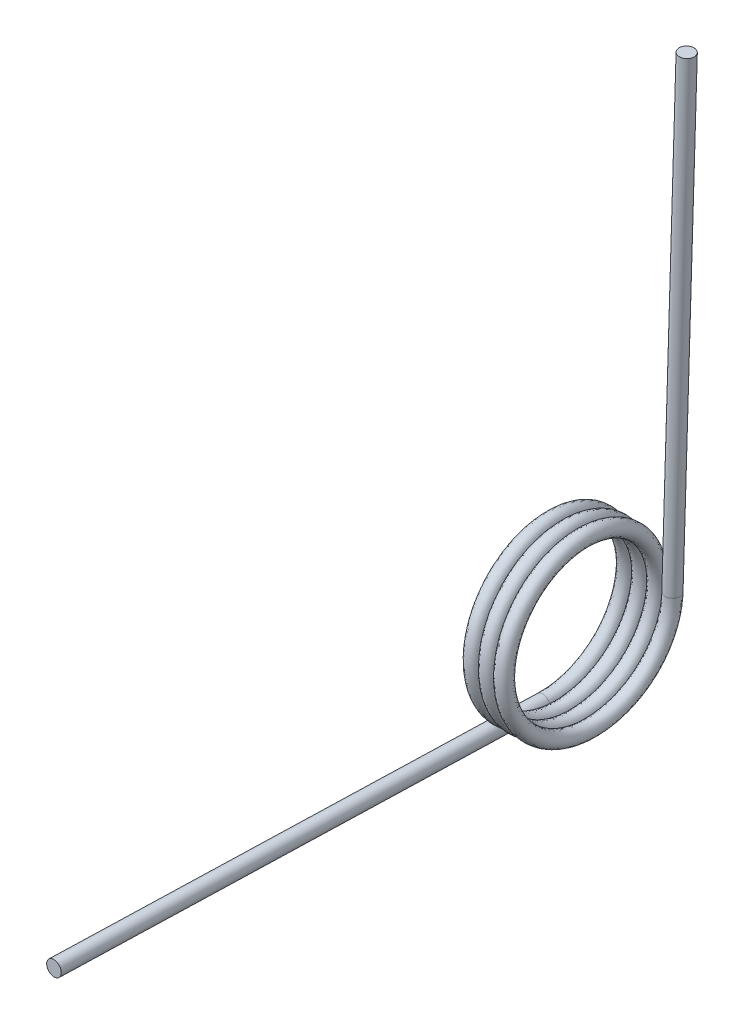
ISO-10303-21;
HEADER;
FILE_DESCRIPTION(('STEP AP214'),'2;1');
FILE_NAME('part.step','',(''),(''),'','','');
FILE_SCHEMA(('AUTOMOTIVE_DESIGN { 1 0 10303 214 1 1 1 1 }'));
ENDSEC;
DATA;
#1=APPLICATION_CONTEXT('core data for automotive mechanical design processes');
#2=APPLICATION_PROTOCOL_DEFINITION('international standard','automotive_design',2000,#1);
#3=PRODUCT_CONTEXT('',#1,'mechanical');
#4=PRODUCT('Part','Part','',(#3));
#5=PRODUCT_RELATED_PRODUCT_CATEGORY('part','',(#4));
#6=PRODUCT_DEFINITION_FORMATION('','',#4);
#7=PRODUCT_DEFINITION_CONTEXT('part definition',#1,'design');
#8=PRODUCT_DEFINITION('design','',#6,#7);
#9=PRODUCT_DEFINITION_SHAPE('','',#8);
#10=(LENGTH_UNIT() NAMED_UNIT(*) SI_UNIT(.MILLI.,.METRE.));
#11=(NAMED_UNIT(*) PLANE_ANGLE_UNIT() SI_UNIT($,.RADIAN.));
#12=(NAMED_UNIT(*) SI_UNIT($,.STERADIAN.) SOLID_ANGLE_UNIT());
#13=UNCERTAINTY_MEASURE_WITH_UNIT(LENGTH_MEASURE(1.E-05),#10,'distance_accuracy_value','');
#14=(GEOMETRIC_REPRESENTATION_CONTEXT(3) GLOBAL_UNCERTAINTY_ASSIGNED_CONTEXT((#13)) GLOBAL_UNIT_ASSIGNED_CONTEXT((#10,
#11,#12)) REPRESENTATION_CONTEXT('',''));
#15=CARTESIAN_POINT('',(0.,0.,0.));
#16=DIRECTION('',(0.,0.,1.));
#17=DIRECTION('',(1.,0.,0.));
#18=AXIS2_PLACEMENT_3D('',#15,#16,#17);
#19=CARTESIAN_POINT('',(-1.20595359726786,-12.8905,-0.0363066279999078));
#20=CARTESIAN_POINT('',(-1.00275359726786,-12.8695383585509,-7.47864027298878));
#21=CARTESIAN_POINT('',(-0.799553597267859,-6.41380753782633,-11.1816537814833));
#22=CARTESIAN_POINT('',(-0.59635359726786,0.0419232828982278,-14.8846672899777));
#23=CARTESIAN_POINT('',(-0.39315359726786,6.47669246217367,-11.1453471534834));
#24=CARTESIAN_POINT('',(-0.189953597267861,12.9114616414491,-7.40602701698897));
#25=CARTESIAN_POINT('',(0.0132464027321386,12.8905,0.0363066279999062));
#26=CARTESIAN_POINT('',(0.216446402732138,12.8695383585509,7.47864027298878));
#27=CARTESIAN_POINT('',(0.419646402732138,6.41380753782633,11.1816537814833));
#28=CARTESIAN_POINT('',(0.622846402732137,-0.041923282898226,14.8846672899777));
#29=CARTESIAN_POINT('',(0.826046402732136,-6.47669246217366,11.1453471534834));
#30=CARTESIAN_POINT('',(1.02924640273214,-12.9114616414491,7.40602701698897));
#31=CARTESIAN_POINT('',(1.23244640273214,-12.8905,-0.0363066279999078));
#32=CARTESIAN_POINT('',(1.43564640273214,-12.8695383585509,-7.47864027298878));
#33=CARTESIAN_POINT('',(1.63884640273213,-6.41380753782633,-11.1816537814833));
#34=CARTESIAN_POINT('',(1.84204640273213,0.0419232828982278,-14.8846672899777));
#35=CARTESIAN_POINT('',(2.04524640273213,6.47669246217367,-11.1453471534834));
#36=CARTESIAN_POINT('',(2.24844640273213,12.9114616414491,-7.40602701698897));
#37=CARTESIAN_POINT('',(2.45164640273213,12.8905,0.0363066279999062));
#38=CARTESIAN_POINT('',(2.65484640273213,12.8695383585509,7.47864027298878));
#39=CARTESIAN_POINT('',(2.85804640273213,6.41380753782633,11.1816537814833));
#40=CARTESIAN_POINT('',(3.06124640273213,-0.041923282898226,14.8846672899777));
#41=CARTESIAN_POINT('',(3.26444640273213,-6.47669246217366,11.1453471534834));
#42=CARTESIAN_POINT('',(3.46764640273213,-12.9114616414491,7.40602701698897));
#43=CARTESIAN_POINT('',(3.67084640273213,-12.8905,-0.0363066279999078));
#44=CARTESIAN_POINT('',(3.87404640273213,-12.8695383585509,-7.47864027298878));
#45=CARTESIAN_POINT('',(4.07724640273213,-6.41380753782633,-11.1816537814833));
#46=CARTESIAN_POINT('',(4.28044640273213,0.0419232828982278,-14.8846672899777));
#47=CARTESIAN_POINT('',(4.48364640273213,6.47669246217367,-11.1453471534834));
#48=CARTESIAN_POINT('',(4.68684640273213,12.9114616414491,-7.40602701698897));
#49=CARTESIAN_POINT('',(4.89004640273213,12.8905,0.0363066279999062));
#50=CARTESIAN_POINT('',(5.09324640273213,12.8695383585509,7.47864027298878));
#51=CARTESIAN_POINT('',(5.29644640273213,6.41380753782633,11.1816537814833));
#52=CARTESIAN_POINT('',(5.49964640273213,-0.041923282898226,14.8846672899777));
#53=CARTESIAN_POINT('',(5.70284640273212,-6.47669246217366,11.1453471534834));
#54=CARTESIAN_POINT('',(5.90604640273212,-12.9114616414491,7.40602701698897));
#55=CARTESIAN_POINT('',(6.10924640273212,-12.8905,-0.0363066279999078));
#56=CARTESIAN_POINT('',(6.31244640273212,-12.8695383585509,-7.47864027298878));
#57=CARTESIAN_POINT('',(6.51564640273212,-6.41380753782633,-11.1816537814833));
#58=CARTESIAN_POINT('',(6.71884640273212,0.0419232828982278,-14.8846672899777));
#59=CARTESIAN_POINT('',(6.92204640273212,6.47669246217367,-11.1453471534834));
#60=CARTESIAN_POINT('',(7.12524640273212,12.9114616414491,-7.40602701698897));
#61=CARTESIAN_POINT('',(7.32844640273212,12.8905,0.0363066279999062));
#62=CARTESIAN_POINT('',(7.53164640273212,12.8695383585509,7.47864027298878));
#63=CARTESIAN_POINT('',(7.73484640273212,6.41380753782633,11.1816537814833));
#64=CARTESIAN_POINT('',(7.93804640273212,-0.041923282898226,14.8846672899777));
#65=CARTESIAN_POINT('',(8.14124640273212,-6.47669246217366,11.1453471534834));
#66=CARTESIAN_POINT('',(8.34444640273212,-12.9114616414491,7.40602701698897));
#67=CARTESIAN_POINT('',(8.54764640273212,-12.8905,-0.0363066279999078));
#68=CARTESIAN_POINT('',(-1.20595359726786,-10.4775,-0.0363066279998857));
#69=CARTESIAN_POINT('',(-1.00275359726786,-10.4565383585509,-6.08549407343419));
#70=CARTESIAN_POINT('',(-0.79955359726786,-5.20730753782635,-9.0919344821514));
#71=CARTESIAN_POINT('',(-0.596353597267861,0.0419232828982025,-12.0983748908686));
#72=CARTESIAN_POINT('',(-0.393153597267861,5.27019246217365,-9.05562785415152));
#73=CARTESIAN_POINT('',(-0.189953597267862,10.4984616414491,-6.01288081743442));
#74=CARTESIAN_POINT('',(0.013246402732138,10.4775,0.0363066279998845));
#75=CARTESIAN_POINT('',(0.216446402732137,10.4565383585509,6.08549407343419));
#76=CARTESIAN_POINT('',(0.419646402732137,5.20730753782635,9.0919344821514));
#77=CARTESIAN_POINT('',(0.622846402732137,-0.0419232828982011,12.0983748908686));
#78=CARTESIAN_POINT('',(0.826046402732136,-5.27019246217364,9.05562785415152));
#79=CARTESIAN_POINT('',(1.02924640273214,-10.4984616414491,6.01288081743443));
#80=CARTESIAN_POINT('',(1.23244640273213,-10.4775,-0.0363066279998857));
#81=CARTESIAN_POINT('',(1.43564640273213,-10.4565383585509,-6.08549407343419));
#82=CARTESIAN_POINT('',(1.63884640273213,-5.20730753782635,-9.0919344821514));
#83=CARTESIAN_POINT('',(1.84204640273213,0.0419232828982025,-12.0983748908686));
#84=CARTESIAN_POINT('',(2.04524640273213,5.27019246217365,-9.05562785415152));
#85=CARTESIAN_POINT('',(2.24844640273213,10.4984616414491,-6.01288081743442));
#86=CARTESIAN_POINT('',(2.45164640273213,10.4775,0.0363066279998845));
#87=CARTESIAN_POINT('',(2.65484640273213,10.4565383585509,6.08549407343419));
#88=CARTESIAN_POINT('',(2.85804640273213,5.20730753782635,9.0919344821514));
#89=CARTESIAN_POINT('',(3.06124640273213,-0.0419232828982011,12.0983748908686));
#90=CARTESIAN_POINT('',(3.26444640273213,-5.27019246217364,9.05562785415152));
#91=CARTESIAN_POINT('',(3.46764640273213,-10.4984616414491,6.01288081743443));
#92=CARTESIAN_POINT('',(3.67084640273213,-10.4775,-0.0363066279998857));
#93=CARTESIAN_POINT('',(3.87404640273213,-10.4565383585509,-6.08549407343419));
#94=CARTESIAN_POINT('',(4.07724640273213,-5.20730753782635,-9.0919344821514));
#95=CARTESIAN_POINT('',(4.28044640273213,0.0419232828982025,-12.0983748908686));
#96=CARTESIAN_POINT('',(4.48364640273213,5.27019246217365,-9.05562785415152));
#97=CARTESIAN_POINT('',(4.68684640273213,10.4984616414491,-6.01288081743442));
#98=CARTESIAN_POINT('',(4.89004640273213,10.4775,0.0363066279998845));
#99=CARTESIAN_POINT('',(5.09324640273212,10.4565383585509,6.08549407343419));
#100=CARTESIAN_POINT('',(5.29644640273213,5.20730753782635,9.0919344821514));
#101=CARTESIAN_POINT('',(5.49964640273212,-0.0419232828982011,12.0983748908686));
#102=CARTESIAN_POINT('',(5.70284640273212,-5.27019246217364,9.05562785415152));
#103=CARTESIAN_POINT('',(5.90604640273212,-10.4984616414491,6.01288081743443));
#104=CARTESIAN_POINT('',(6.10924640273212,-10.4775,-0.0363066279998857));
#105=CARTESIAN_POINT('',(6.31244640273212,-10.4565383585509,-6.08549407343419));
#106=CARTESIAN_POINT('',(6.51564640273212,-5.20730753782635,-9.0919344821514));
#107=CARTESIAN_POINT('',(6.71884640273212,0.0419232828982025,-12.0983748908686));
#108=CARTESIAN_POINT('',(6.92204640273212,5.27019246217365,-9.05562785415152));
#109=CARTESIAN_POINT('',(7.12524640273212,10.4984616414491,-6.01288081743442));
#110=CARTESIAN_POINT('',(7.32844640273212,10.4775,0.0363066279998845));
#111=CARTESIAN_POINT('',(7.53164640273212,10.4565383585509,6.08549407343419));
#112=CARTESIAN_POINT('',(7.73484640273212,5.20730753782635,9.0919344821514));
#113=CARTESIAN_POINT('',(7.93804640273212,-0.0419232828982011,12.0983748908686));
#114=CARTESIAN_POINT('',(8.14124640273212,-5.27019246217364,9.05562785415152));
#115=CARTESIAN_POINT('',(8.34444640273212,-10.4984616414491,6.01288081743443));
#116=CARTESIAN_POINT('',(8.54764640273212,-10.4775,-0.0363066279998857));
#117=CARTESIAN_POINT('',(1.20595359726786,-10.4775,0.0363066279996597));
#118=CARTESIAN_POINT('',(1.40915359726786,-10.498461641449,-6.01288081743464));
#119=CARTESIAN_POINT('',(1.61235359726786,-5.27019246217346,-9.05562785415163));
#120=CARTESIAN_POINT('',(1.81555359726786,-0.041923282897943,-12.0983748908686));
#121=CARTESIAN_POINT('',(2.01875359726785,5.20730753782654,-9.09193448215129));
#122=CARTESIAN_POINT('',(2.22195359726785,10.456538358551,-6.08549407343397));
#123=CARTESIAN_POINT('',(2.42515359726785,10.4775,-0.036306627999661));
#124=CARTESIAN_POINT('',(2.62835359726785,10.498461641449,6.01288081743464));
#125=CARTESIAN_POINT('',(2.83155359726785,5.27019246217346,9.05562785415163));
#126=CARTESIAN_POINT('',(3.03475359726785,0.0419232828979445,12.0983748908686));
#127=CARTESIAN_POINT('',(3.23795359726785,-5.20730753782654,9.09193448215129));
#128=CARTESIAN_POINT('',(3.44115359726785,-10.456538358551,6.08549407343397));
#129=CARTESIAN_POINT('',(3.64435359726785,-10.4775,0.0363066279996597));
#130=CARTESIAN_POINT('',(3.84755359726785,-10.498461641449,-6.01288081743464));
#131=CARTESIAN_POINT('',(4.05075359726785,-5.27019246217346,-9.05562785415163));
#132=CARTESIAN_POINT('',(4.25395359726785,-0.041923282897943,-12.0983748908686));
#133=CARTESIAN_POINT('',(4.45715359726785,5.20730753782654,-9.09193448215129));
#134=CARTESIAN_POINT('',(4.66035359726785,10.456538358551,-6.08549407343397));
#135=CARTESIAN_POINT('',(4.86355359726785,10.4775,-0.036306627999661));
#136=CARTESIAN_POINT('',(5.06675359726785,10.498461641449,6.01288081743464));
#137=CARTESIAN_POINT('',(5.26995359726785,5.27019246217346,9.05562785415163));
#138=CARTESIAN_POINT('',(5.47315359726785,0.0419232828979445,12.0983748908686));
#139=CARTESIAN_POINT('',(5.67635359726785,-5.20730753782654,9.09193448215129));
#140=CARTESIAN_POINT('',(5.87955359726785,-10.456538358551,6.08549407343397));
#141=CARTESIAN_POINT('',(6.08275359726784,-10.4775,0.0363066279996597));
#142=CARTESIAN_POINT('',(6.28595359726785,-10.498461641449,-6.01288081743464));
#143=CARTESIAN_POINT('',(6.48915359726784,-5.27019246217346,-9.05562785415163));
#144=CARTESIAN_POINT('',(6.69235359726784,-0.041923282897943,-12.0983748908686));
#145=CARTESIAN_POINT('',(6.89555359726784,5.20730753782654,-9.09193448215129));
#146=CARTESIAN_POINT('',(7.09875359726784,10.456538358551,-6.08549407343397));
#147=CARTESIAN_POINT('',(7.30195359726784,10.4775,-0.036306627999661));
#148=CARTESIAN_POINT('',(7.50515359726784,10.498461641449,6.01288081743464));
#149=CARTESIAN_POINT('',(7.70835359726784,5.27019246217346,9.05562785415163));
#150=CARTESIAN_POINT('',(7.91155359726784,0.0419232828979445,12.0983748908686));
#151=CARTESIAN_POINT('',(8.11475359726784,-5.20730753782654,9.09193448215129));
#152=CARTESIAN_POINT('',(8.31795359726784,-10.456538358551,6.08549407343397));
#153=CARTESIAN_POINT('',(8.52115359726784,-10.4775,0.0363066279996597));
#154=CARTESIAN_POINT('',(8.72435359726784,-10.498461641449,-6.01288081743464));
#155=CARTESIAN_POINT('',(8.92755359726784,-5.27019246217346,-9.05562785415163));
#156=CARTESIAN_POINT('',(9.13075359726784,-0.041923282897943,-12.0983748908686));
#157=CARTESIAN_POINT('',(9.33395359726783,5.20730753782654,-9.09193448215129));
#158=CARTESIAN_POINT('',(9.53715359726784,10.456538358551,-6.08549407343397));
#159=CARTESIAN_POINT('',(9.74035359726783,10.4775,-0.036306627999661));
#160=CARTESIAN_POINT('',(9.94355359726783,10.498461641449,6.01288081743464));
#161=CARTESIAN_POINT('',(10.1467535972678,5.27019246217346,9.05562785415163));
#162=CARTESIAN_POINT('',(10.3499535972678,0.0419232828979445,12.0983748908686));
#163=CARTESIAN_POINT('',(10.5531535972678,-5.20730753782654,9.09193448215129));
#164=CARTESIAN_POINT('',(10.7563535972678,-10.456538358551,6.08549407343397));
#165=CARTESIAN_POINT('',(10.9595535972678,-10.4775,0.0363066279996597));
#166=CARTESIAN_POINT('',(1.20595359726786,-12.8905,0.0363066279996377));
#167=CARTESIAN_POINT('',(1.40915359726786,-12.911461641449,-7.40602701698923));
#168=CARTESIAN_POINT('',(1.61235359726786,-6.47669246217344,-11.1453471534835));
#169=CARTESIAN_POINT('',(1.81555359726786,-0.0419232828979178,-14.8846672899777));
#170=CARTESIAN_POINT('',(2.01875359726786,6.41380753782656,-11.1816537814831));
#171=CARTESIAN_POINT('',(2.22195359726785,12.869538358551,-7.47864027298851));
#172=CARTESIAN_POINT('',(2.42515359726785,12.8905,-0.0363066279996393));
#173=CARTESIAN_POINT('',(2.62835359726785,12.911461641449,7.40602701698923));
#174=CARTESIAN_POINT('',(2.83155359726785,6.47669246217344,11.1453471534835));
#175=CARTESIAN_POINT('',(3.03475359726785,0.0419232828979196,14.8846672899777));
#176=CARTESIAN_POINT('',(3.23795359726785,-6.41380753782655,11.1816537814831));
#177=CARTESIAN_POINT('',(3.44115359726785,-12.869538358551,7.47864027298852));
#178=CARTESIAN_POINT('',(3.64435359726785,-12.8905,0.0363066279996377));
#179=CARTESIAN_POINT('',(3.84755359726785,-12.911461641449,-7.40602701698923));
#180=CARTESIAN_POINT('',(4.05075359726785,-6.47669246217344,-11.1453471534835));
#181=CARTESIAN_POINT('',(4.25395359726785,-0.0419232828979178,-14.8846672899777));
#182=CARTESIAN_POINT('',(4.45715359726785,6.41380753782656,-11.1816537814831));
#183=CARTESIAN_POINT('',(4.66035359726785,12.869538358551,-7.47864027298851));
#184=CARTESIAN_POINT('',(4.86355359726785,12.8905,-0.0363066279996393));
#185=CARTESIAN_POINT('',(5.06675359726785,12.911461641449,7.40602701698923));
#186=CARTESIAN_POINT('',(5.26995359726785,6.47669246217344,11.1453471534835));
#187=CARTESIAN_POINT('',(5.47315359726785,0.0419232828979196,14.8846672899777));
#188=CARTESIAN_POINT('',(5.67635359726785,-6.41380753782655,11.1816537814831));
#189=CARTESIAN_POINT('',(5.87955359726785,-12.869538358551,7.47864027298852));
#190=CARTESIAN_POINT('',(6.08275359726785,-12.8905,0.0363066279996377));
#191=CARTESIAN_POINT('',(6.28595359726785,-12.911461641449,-7.40602701698923));
#192=CARTESIAN_POINT('',(6.48915359726784,-6.47669246217344,-11.1453471534835));
#193=CARTESIAN_POINT('',(6.69235359726784,-0.0419232828979178,-14.8846672899777));
#194=CARTESIAN_POINT('',(6.89555359726784,6.41380753782656,-11.1816537814831));
#195=CARTESIAN_POINT('',(7.09875359726784,12.869538358551,-7.47864027298851));
#196=CARTESIAN_POINT('',(7.30195359726784,12.8905,-0.0363066279996393));
#197=CARTESIAN_POINT('',(7.50515359726784,12.911461641449,7.40602701698923));
#198=CARTESIAN_POINT('',(7.70835359726784,6.47669246217344,11.1453471534835));
#199=CARTESIAN_POINT('',(7.91155359726784,0.0419232828979196,14.8846672899777));
#200=CARTESIAN_POINT('',(8.11475359726784,-6.41380753782655,11.1816537814831));
#201=CARTESIAN_POINT('',(8.31795359726784,-12.869538358551,7.47864027298852));
#202=CARTESIAN_POINT('',(8.52115359726784,-12.8905,0.0363066279996377));
#203=CARTESIAN_POINT('',(8.72435359726784,-12.911461641449,-7.40602701698923));
#204=CARTESIAN_POINT('',(8.92755359726784,-6.47669246217344,-11.1453471534835));
#205=CARTESIAN_POINT('',(9.13075359726784,-0.0419232828979178,-14.8846672899777));
#206=CARTESIAN_POINT('',(9.33395359726784,6.41380753782656,-11.1816537814831));
#207=CARTESIAN_POINT('',(9.53715359726784,12.869538358551,-7.47864027298851));
#208=CARTESIAN_POINT('',(9.74035359726784,12.8905,-0.0363066279996393));
#209=CARTESIAN_POINT('',(9.94355359726783,12.911461641449,7.40602701698923));
#210=CARTESIAN_POINT('',(10.1467535972678,6.47669246217344,11.1453471534835));
#211=CARTESIAN_POINT('',(10.3499535972678,0.0419232828979196,14.8846672899777));
#212=CARTESIAN_POINT('',(10.5531535972678,-6.41380753782655,11.1816537814831));
#213=CARTESIAN_POINT('',(10.7563535972678,-12.869538358551,7.47864027298852));
#214=CARTESIAN_POINT('',(10.9595535972678,-12.8905,0.0363066279996377));
#215=CARTESIAN_POINT('',(1.20595359726786,-15.3035,0.0363066279996157));
#216=CARTESIAN_POINT('',(1.40915359726786,-15.3244616414489,-8.79917321654382));
#217=CARTESIAN_POINT('',(1.61235359726786,-7.68319246217342,-13.2350664528154));
#218=CARTESIAN_POINT('',(1.81555359726786,-0.0419232828978925,-17.6709596890869));
#219=CARTESIAN_POINT('',(2.01875359726786,7.62030753782658,-13.271373080815));
#220=CARTESIAN_POINT('',(2.22195359726786,15.2825383585511,-8.87178647254306));
#221=CARTESIAN_POINT('',(2.42515359726786,15.3035,-0.0363066279996175));
#222=CARTESIAN_POINT('',(2.62835359726786,15.324461641449,8.79917321654382));
#223=CARTESIAN_POINT('',(2.83155359726785,7.68319246217343,13.2350664528153));
#224=CARTESIAN_POINT('',(3.03475359726785,0.0419232828978947,17.6709596890869));
#225=CARTESIAN_POINT('',(3.23795359726785,-7.62030753782657,13.271373080815));
#226=CARTESIAN_POINT('',(3.44115359726785,-15.2825383585511,8.87178647254306));
#227=CARTESIAN_POINT('',(3.64435359726785,-15.3035,0.0363066279996157));
#228=CARTESIAN_POINT('',(3.84755359726785,-15.3244616414489,-8.79917321654382));
#229=CARTESIAN_POINT('',(4.05075359726785,-7.68319246217342,-13.2350664528154));
#230=CARTESIAN_POINT('',(4.25395359726785,-0.0419232828978925,-17.6709596890869));
#231=CARTESIAN_POINT('',(4.45715359726785,7.62030753782658,-13.271373080815));
#232=CARTESIAN_POINT('',(4.66035359726785,15.2825383585511,-8.87178647254306));
#233=CARTESIAN_POINT('',(4.86355359726785,15.3035,-0.0363066279996175));
#234=CARTESIAN_POINT('',(5.06675359726785,15.324461641449,8.79917321654382));
#235=CARTESIAN_POINT('',(5.26995359726785,7.68319246217343,13.2350664528153));
#236=CARTESIAN_POINT('',(5.47315359726785,0.0419232828978947,17.6709596890869));
#237=CARTESIAN_POINT('',(5.67635359726785,-7.62030753782657,13.271373080815));
#238=CARTESIAN_POINT('',(5.87955359726785,-15.2825383585511,8.87178647254306));
#239=CARTESIAN_POINT('',(6.08275359726785,-15.3035,0.0363066279996157));
#240=CARTESIAN_POINT('',(6.28595359726785,-15.3244616414489,-8.79917321654382));
#241=CARTESIAN_POINT('',(6.48915359726785,-7.68319246217342,-13.2350664528154));
#242=CARTESIAN_POINT('',(6.69235359726784,-0.0419232828978925,-17.6709596890869));
#243=CARTESIAN_POINT('',(6.89555359726784,7.62030753782658,-13.271373080815));
#244=CARTESIAN_POINT('',(7.09875359726784,15.2825383585511,-8.87178647254306));
#245=CARTESIAN_POINT('',(7.30195359726784,15.3035,-0.0363066279996175));
#246=CARTESIAN_POINT('',(7.50515359726784,15.324461641449,8.79917321654382));
#247=CARTESIAN_POINT('',(7.70835359726784,7.68319246217343,13.2350664528153));
#248=CARTESIAN_POINT('',(7.91155359726784,0.0419232828978947,17.6709596890869));
#249=CARTESIAN_POINT('',(8.11475359726784,-7.62030753782657,13.271373080815));
#250=CARTESIAN_POINT('',(8.31795359726784,-15.2825383585511,8.87178647254306));
#251=CARTESIAN_POINT('',(8.52115359726784,-15.3035,0.0363066279996157));
#252=CARTESIAN_POINT('',(8.72435359726784,-15.3244616414489,-8.79917321654382));
#253=CARTESIAN_POINT('',(8.92755359726784,-7.68319246217342,-13.2350664528154));
#254=CARTESIAN_POINT('',(9.13075359726784,-0.0419232828978925,-17.6709596890869));
#255=CARTESIAN_POINT('',(9.33395359726784,7.62030753782658,-13.271373080815));
#256=CARTESIAN_POINT('',(9.53715359726784,15.2825383585511,-8.87178647254306));
#257=CARTESIAN_POINT('',(9.74035359726784,15.3035,-0.0363066279996175));
#258=CARTESIAN_POINT('',(9.94355359726784,15.324461641449,8.79917321654382));
#259=CARTESIAN_POINT('',(10.1467535972678,7.68319246217343,13.2350664528153));
#260=CARTESIAN_POINT('',(10.3499535972678,0.0419232828978947,17.6709596890869));
#261=CARTESIAN_POINT('',(10.5531535972678,-7.62030753782657,13.271373080815));
#262=CARTESIAN_POINT('',(10.7563535972678,-15.2825383585511,8.87178647254306));
#263=CARTESIAN_POINT('',(10.9595535972678,-15.3035,0.0363066279996157));
#264=CARTESIAN_POINT('',(-1.20595359726786,-15.3035,-0.0363066279999298));
#265=CARTESIAN_POINT('',(-1.00275359726786,-15.2825383585509,-8.87178647254337));
#266=CARTESIAN_POINT('',(-0.799553597267859,-7.62030753782631,-13.2713730808151));
#267=CARTESIAN_POINT('',(-0.596353597267859,0.0419232828982531,-17.6709596890869));
#268=CARTESIAN_POINT('',(-0.39315359726786,7.68319246217369,-13.2350664528152));
#269=CARTESIAN_POINT('',(-0.18995359726786,15.3244616414491,-8.79917321654352));
#270=CARTESIAN_POINT('',(0.0132464027321393,15.3035,0.0363066279999279));
#271=CARTESIAN_POINT('',(0.216446402732139,15.2825383585509,8.87178647254336));
#272=CARTESIAN_POINT('',(0.419646402732138,7.62030753782632,13.2713730808151));
#273=CARTESIAN_POINT('',(0.622846402732138,-0.0419232828982509,17.6709596890869));
#274=CARTESIAN_POINT('',(0.826046402732137,-7.68319246217368,13.2350664528152));
#275=CARTESIAN_POINT('',(1.02924640273214,-15.3244616414491,8.79917321654352));
#276=CARTESIAN_POINT('',(1.23244640273214,-15.3035,-0.0363066279999298));
#277=CARTESIAN_POINT('',(1.43564640273214,-15.2825383585509,-8.87178647254337));
#278=CARTESIAN_POINT('',(1.63884640273214,-7.62030753782631,-13.2713730808151));
#279=CARTESIAN_POINT('',(1.84204640273213,0.0419232828982531,-17.6709596890869));
#280=CARTESIAN_POINT('',(2.04524640273213,7.68319246217369,-13.2350664528152));
#281=CARTESIAN_POINT('',(2.24844640273213,15.3244616414491,-8.79917321654352));
#282=CARTESIAN_POINT('',(2.45164640273213,15.3035,0.0363066279999279));
#283=CARTESIAN_POINT('',(2.65484640273213,15.2825383585509,8.87178647254336));
#284=CARTESIAN_POINT('',(2.85804640273213,7.62030753782632,13.2713730808151));
#285=CARTESIAN_POINT('',(3.06124640273213,-0.0419232828982509,17.6709596890869));
#286=CARTESIAN_POINT('',(3.26444640273213,-7.68319246217368,13.2350664528152));
#287=CARTESIAN_POINT('',(3.46764640273213,-15.3244616414491,8.79917321654352));
#288=CARTESIAN_POINT('',(3.67084640273213,-15.3035,-0.0363066279999298));
#289=CARTESIAN_POINT('',(3.87404640273213,-15.2825383585509,-8.87178647254337));
#290=CARTESIAN_POINT('',(4.07724640273213,-7.62030753782631,-13.2713730808151));
#291=CARTESIAN_POINT('',(4.28044640273213,0.0419232828982531,-17.6709596890869));
#292=CARTESIAN_POINT('',(4.48364640273213,7.68319246217369,-13.2350664528152));
#293=CARTESIAN_POINT('',(4.68684640273213,15.3244616414491,-8.79917321654352));
#294=CARTESIAN_POINT('',(4.89004640273213,15.3035,0.0363066279999279));
#295=CARTESIAN_POINT('',(5.09324640273213,15.2825383585509,8.87178647254336));
#296=CARTESIAN_POINT('',(5.29644640273213,7.62030753782632,13.2713730808151));
#297=CARTESIAN_POINT('',(5.49964640273213,-0.0419232828982509,17.6709596890869));
#298=CARTESIAN_POINT('',(5.70284640273213,-7.68319246217368,13.2350664528152));
#299=CARTESIAN_POINT('',(5.90604640273212,-15.3244616414491,8.79917321654352));
#300=CARTESIAN_POINT('',(6.10924640273212,-15.3035,-0.0363066279999298));
#301=CARTESIAN_POINT('',(6.31244640273212,-15.2825383585509,-8.87178647254337));
#302=CARTESIAN_POINT('',(6.51564640273212,-7.62030753782631,-13.2713730808151));
#303=CARTESIAN_POINT('',(6.71884640273212,0.0419232828982531,-17.6709596890869));
#304=CARTESIAN_POINT('',(6.92204640273212,7.68319246217369,-13.2350664528152));
#305=CARTESIAN_POINT('',(7.12524640273212,15.3244616414491,-8.79917321654352));
#306=CARTESIAN_POINT('',(7.32844640273212,15.3035,0.0363066279999279));
#307=CARTESIAN_POINT('',(7.53164640273212,15.2825383585509,8.87178647254336));
#308=CARTESIAN_POINT('',(7.73484640273212,7.62030753782632,13.2713730808151));
#309=CARTESIAN_POINT('',(7.93804640273212,-0.0419232828982509,17.6709596890869));
#310=CARTESIAN_POINT('',(8.14124640273212,-7.68319246217368,13.2350664528152));
#311=CARTESIAN_POINT('',(8.34444640273212,-15.3244616414491,8.79917321654352));
#312=CARTESIAN_POINT('',(8.54764640273212,-15.3035,-0.0363066279999298));
#313=CARTESIAN_POINT('',(-1.20595359726786,-12.8905,-0.0363066279999078));
#314=CARTESIAN_POINT('',(-1.00275359726786,-12.8695383585509,-7.47864027298878));
#315=CARTESIAN_POINT('',(-0.799553597267859,-6.41380753782633,-11.1816537814833));
#316=CARTESIAN_POINT('',(-0.59635359726786,0.0419232828982278,-14.8846672899777));
#317=CARTESIAN_POINT('',(-0.39315359726786,6.47669246217367,-11.1453471534834));
#318=CARTESIAN_POINT('',(-0.189953597267861,12.9114616414491,-7.40602701698897));
#319=CARTESIAN_POINT('',(0.0132464027321386,12.8905,0.0363066279999062));
#320=CARTESIAN_POINT('',(0.216446402732138,12.8695383585509,7.47864027298878));
#321=CARTESIAN_POINT('',(0.419646402732138,6.41380753782633,11.1816537814833));
#322=CARTESIAN_POINT('',(0.622846402732137,-0.041923282898226,14.8846672899777));
#323=CARTESIAN_POINT('',(0.826046402732136,-6.47669246217366,11.1453471534834));
#324=CARTESIAN_POINT('',(1.02924640273214,-12.9114616414491,7.40602701698897));
#325=CARTESIAN_POINT('',(1.23244640273214,-12.8905,-0.0363066279999078));
#326=CARTESIAN_POINT('',(1.43564640273214,-12.8695383585509,-7.47864027298878));
#327=CARTESIAN_POINT('',(1.63884640273213,-6.41380753782633,-11.1816537814833));
#328=CARTESIAN_POINT('',(1.84204640273213,0.0419232828982278,-14.8846672899777));
#329=CARTESIAN_POINT('',(2.04524640273213,6.47669246217367,-11.1453471534834));
#330=CARTESIAN_POINT('',(2.24844640273213,12.9114616414491,-7.40602701698897));
#331=CARTESIAN_POINT('',(2.45164640273213,12.8905,0.0363066279999062));
#332=CARTESIAN_POINT('',(2.65484640273213,12.8695383585509,7.47864027298878));
#333=CARTESIAN_POINT('',(2.85804640273213,6.41380753782633,11.1816537814833));
#334=CARTESIAN_POINT('',(3.06124640273213,-0.041923282898226,14.8846672899777));
#335=CARTESIAN_POINT('',(3.26444640273213,-6.47669246217366,11.1453471534834));
#336=CARTESIAN_POINT('',(3.46764640273213,-12.9114616414491,7.40602701698897));
#337=CARTESIAN_POINT('',(3.67084640273213,-12.8905,-0.0363066279999078));
#338=CARTESIAN_POINT('',(3.87404640273213,-12.8695383585509,-7.47864027298878));
#339=CARTESIAN_POINT('',(4.07724640273213,-6.41380753782633,-11.1816537814833));
#340=CARTESIAN_POINT('',(4.28044640273213,0.0419232828982278,-14.8846672899777));
#341=CARTESIAN_POINT('',(4.48364640273213,6.47669246217367,-11.1453471534834));
#342=CARTESIAN_POINT('',(4.68684640273213,12.9114616414491,-7.40602701698897));
#343=CARTESIAN_POINT('',(4.89004640273213,12.8905,0.0363066279999062));
#344=CARTESIAN_POINT('',(5.09324640273213,12.8695383585509,7.47864027298878));
#345=CARTESIAN_POINT('',(5.29644640273213,6.41380753782633,11.1816537814833));
#346=CARTESIAN_POINT('',(5.49964640273213,-0.041923282898226,14.8846672899777));
#347=CARTESIAN_POINT('',(5.70284640273212,-6.47669246217366,11.1453471534834));
#348=CARTESIAN_POINT('',(5.90604640273212,-12.9114616414491,7.40602701698897));
#349=CARTESIAN_POINT('',(6.10924640273212,-12.8905,-0.0363066279999078));
#350=CARTESIAN_POINT('',(6.31244640273212,-12.8695383585509,-7.47864027298878));
#351=CARTESIAN_POINT('',(6.51564640273212,-6.41380753782633,-11.1816537814833));
#352=CARTESIAN_POINT('',(6.71884640273212,0.0419232828982278,-14.8846672899777));
#353=CARTESIAN_POINT('',(6.92204640273212,6.47669246217367,-11.1453471534834));
#354=CARTESIAN_POINT('',(7.12524640273212,12.9114616414491,-7.40602701698897));
#355=CARTESIAN_POINT('',(7.32844640273212,12.8905,0.0363066279999062));
#356=CARTESIAN_POINT('',(7.53164640273212,12.8695383585509,7.47864027298878));
#357=CARTESIAN_POINT('',(7.73484640273212,6.41380753782633,11.1816537814833));
#358=CARTESIAN_POINT('',(7.93804640273212,-0.041923282898226,14.8846672899777));
#359=CARTESIAN_POINT('',(8.14124640273212,-6.47669246217366,11.1453471534834));
#360=CARTESIAN_POINT('',(8.34444640273212,-12.9114616414491,7.40602701698897));
#361=CARTESIAN_POINT('',(8.54764640273212,-12.8905,-0.0363066279999078));
#362=(BOUNDED_SURFACE() B_SPLINE_SURFACE(3,2,((#19,#20,#21,#22,#23,#24,#25,#26,#27,#28,#29,#30,
#31,#32,#33,#34,#35,#36,#37,#38,#39,#40,#41,#42,#43,#44,#45,#46,#47,#48,#49,#50,#51,#52,#53,#54,
#55,#56,#57,#58,#59,#60,#61,#62,#63,#64,#65,#66,#67),(#68,#69,#70,#71,#72,#73,#74,#75,#76,#77,
#78,#79,#80,#81,#82,#83,#84,#85,#86,#87,#88,#89,#90,#91,#92,#93,#94,#95,#96,#97,#98,#99,#100,
#101,#102,#103,#104,#105,#106,#107,#108,#109,#110,#111,#112,#113,#114,#115,#116),(#117,#118,
#119,#120,#121,#122,#123,#124,#125,#126,#127,#128,#129,#130,#131,#132,#133,#134,#135,#136,#137,
#138,#139,#140,#141,#142,#143,#144,#145,#146,#147,#148,#149,#150,#151,#152,#153,#154,#155,#156,
#157,#158,#159,#160,#161,#162,#163,#164,#165),(#166,#167,#168,#169,#170,#171,#172,#173,#174,
#175,#176,#177,#178,#179,#180,#181,#182,#183,#184,#185,#186,#187,#188,#189,#190,#191,#192,#193,
#194,#195,#196,#197,#198,#199,#200,#201,#202,#203,#204,#205,#206,#207,#208,#209,#210,#211,#212,
#213,#214),(#215,#216,#217,#218,#219,#220,#221,#222,#223,#224,#225,#226,#227,#228,#229,#230,
#231,#232,#233,#234,#235,#236,#237,#238,#239,#240,#241,#242,#243,#244,#245,#246,#247,#248,#249,
#250,#251,#252,#253,#254,#255,#256,#257,#258,#259,#260,#261,#262,#263),(#264,#265,#266,#267,
#268,#269,#270,#271,#272,#273,#274,#275,#276,#277,#278,#279,#280,#281,#282,#283,#284,#285,#286,
#287,#288,#289,#290,#291,#292,#293,#294,#295,#296,#297,#298,#299,#300,#301,#302,#303,#304,#305,
#306,#307,#308,#309,#310,#311,#312),(#313,#314,#315,#316,#317,#318,#319,#320,#321,#322,#323,
#324,#325,#326,#327,#328,#329,#330,#331,#332,#333,#334,#335,#336,#337,#338,#339,#340,#341,#342,
#343,#344,#345,#346,#347,#348,#349,#350,#351,#352,#353,#354,#355,#356,#357,#358,#359,#360,
#361)),.UNSPECIFIED.,.T.,.F.,.F.) B_SPLINE_SURFACE_WITH_KNOTS((4,3,4),(3,2,2,2,2,2,2,2,2,2,2,2,
2,2,2,2,2,2,2,2,2,2,2,2,3),(0.,0.5,1.),(0.,0.0416666666666667,0.0833333333333333,0.125,
0.166666666666667,0.208333333333333,0.25,0.291666666666667,0.333333333333333,0.375,
0.416666666666667,0.458333333333333,0.5,0.541666666666667,0.583333333333333,0.625,
0.666666666666667,0.708333333333333,0.75,0.791666666666667,0.833333333333333,0.875,
0.916666666666667,0.958333333333333,1.),
.UNSPECIFIED.) GEOMETRIC_REPRESENTATION_ITEM() RATIONAL_B_SPLINE_SURFACE(((1.,0.866025403784439,
1.,0.866025403784439,1.,0.866025403784439,1.,0.866025403784439,1.,0.866025403784439,1.,
0.866025403784439,1.,0.866025403784439,1.,0.866025403784439,1.,0.866025403784439,1.,
0.866025403784439,1.,0.866025403784439,1.,0.866025403784439,1.,0.866025403784439,1.,
0.866025403784439,1.,0.866025403784439,1.,0.866025403784439,1.,0.866025403784439,1.,
0.866025403784439,1.,0.866025403784439,1.,0.866025403784439,1.,0.866025403784439,1.,
0.866025403784439,1.,0.866025403784439,1.,0.866025403784439,1.),(0.333333333333333,
0.288675134594813,0.333333333333333,0.288675134594813,0.333333333333333,0.288675134594813,
0.333333333333333,0.288675134594813,0.333333333333333,0.288675134594813,0.333333333333333,
0.288675134594813,0.333333333333333,0.288675134594813,0.333333333333333,0.288675134594813,
0.333333333333333,0.288675134594813,0.333333333333333,0.288675134594813,0.333333333333333,
0.288675134594813,0.333333333333333,0.288675134594813,0.333333333333333,0.288675134594813,
0.333333333333333,0.288675134594813,0.333333333333333,0.288675134594813,0.333333333333333,
0.288675134594813,0.333333333333333,0.288675134594813,0.333333333333333,0.288675134594813,
0.333333333333333,0.288675134594813,0.333333333333333,0.288675134594813,0.333333333333333,
0.288675134594813,0.333333333333333,0.288675134594813,0.333333333333333,0.288675134594813,
0.333333333333333,0.288675134594813,0.333333333333333),(0.333333333333333,0.288675134594813,
0.333333333333333,0.288675134594813,0.333333333333333,0.288675134594813,0.333333333333333,
0.288675134594813,0.333333333333333,0.288675134594813,0.333333333333333,0.288675134594813,
0.333333333333333,0.288675134594813,0.333333333333333,0.288675134594813,0.333333333333333,
0.288675134594813,0.333333333333333,0.288675134594813,0.333333333333333,0.288675134594813,
0.333333333333333,0.288675134594813,0.333333333333333,0.288675134594813,0.333333333333333,
0.288675134594813,0.333333333333333,0.288675134594813,0.333333333333333,0.288675134594813,
0.333333333333333,0.288675134594813,0.333333333333333,0.288675134594813,0.333333333333333,
0.288675134594813,0.333333333333333,0.288675134594813,0.333333333333333,0.288675134594813,
0.333333333333333,0.288675134594813,0.333333333333333,0.288675134594813,0.333333333333333,
0.288675134594813,0.333333333333333),(1.,0.866025403784439,1.,0.866025403784439,1.,
0.866025403784439,1.,0.866025403784439,1.,0.866025403784439,1.,0.866025403784439,1.,
0.866025403784439,1.,0.866025403784439,1.,0.866025403784439,1.,0.866025403784439,1.,
0.866025403784439,1.,0.866025403784439,1.,0.866025403784439,1.,0.866025403784439,1.,
0.866025403784439,1.,0.866025403784439,1.,0.866025403784439,1.,0.866025403784439,1.,
0.866025403784439,1.,0.866025403784439,1.,0.866025403784439,1.,0.866025403784439,1.,
0.866025403784439,1.,0.866025403784439,1.),(0.333333333333333,0.288675134594813,
0.333333333333333,0.288675134594813,0.333333333333333,0.288675134594813,0.333333333333333,
0.288675134594813,0.333333333333333,0.288675134594813,0.333333333333333,0.288675134594813,
0.333333333333333,0.288675134594813,0.333333333333333,0.288675134594813,0.333333333333333,
0.288675134594813,0.333333333333333,0.288675134594813,0.333333333333333,0.288675134594813,
0.333333333333333,0.288675134594813,0.333333333333333,0.288675134594813,0.333333333333333,
0.288675134594813,0.333333333333333,0.288675134594813,0.333333333333333,0.288675134594813,
0.333333333333333,0.288675134594813,0.333333333333333,0.288675134594813,0.333333333333333,
0.288675134594813,0.333333333333333,0.288675134594813,0.333333333333333,0.288675134594813,
0.333333333333333,0.288675134594813,0.333333333333333,0.288675134594813,0.333333333333333,
0.288675134594813,0.333333333333333),(0.333333333333333,0.288675134594813,0.333333333333333,
0.288675134594813,0.333333333333333,0.288675134594813,0.333333333333333,0.288675134594813,
0.333333333333333,0.288675134594813,0.333333333333333,0.288675134594813,0.333333333333333,
0.288675134594813,0.333333333333333,0.288675134594813,0.333333333333333,0.288675134594813,
0.333333333333333,0.288675134594813,0.333333333333333,0.288675134594813,0.333333333333333,
0.288675134594813,0.333333333333333,0.288675134594813,0.333333333333333,0.288675134594813,
0.333333333333333,0.288675134594813,0.333333333333333,0.288675134594813,0.333333333333333,
0.288675134594813,0.333333333333333,0.288675134594813,0.333333333333333,0.288675134594813,
0.333333333333333,0.288675134594813,0.333333333333333,0.288675134594813,0.333333333333333,
0.288675134594813,0.333333333333333,0.288675134594813,0.333333333333333,0.288675134594813,
0.333333333333333),(1.,0.866025403784439,1.,0.866025403784439,1.,0.866025403784439,1.,
0.866025403784439,1.,0.866025403784439,1.,0.866025403784439,1.,0.866025403784439,1.,
0.866025403784439,1.,0.866025403784439,1.,0.866025403784439,1.,0.866025403784439,1.,
0.866025403784439,1.,0.866025403784439,1.,0.866025403784439,1.,0.866025403784439,1.,
0.866025403784439,1.,0.866025403784439,1.,0.866025403784439,1.,0.866025403784439,1.,
0.866025403784439,1.,0.866025403784439,1.,0.866025403784439,1.,0.866025403784439,1.,
0.866025403784439,1.))) REPRESENTATION_ITEM('') SURFACE());
#363=CARTESIAN_POINT('',(7.9248,6.97238608891769E-13,-12.8905));
#364=DIRECTION('',(0.0300925221713823,0.999547117503405,0.));
#365=DIRECTION('',(-0.999547117503405,0.0300925221713823,0.));
#366=AXIS2_PLACEMENT_3D('',#363,#364,#365);
#367=CIRCLE('',#366,1.2065);
#368=CARTESIAN_POINT('',(6.71884640273214,0.03630662800047,-12.8905));
#369=VERTEX_POINT('',#368);
#370=EDGE_CURVE('E10',#369,#369,#367,.T.);
#371=CARTESIAN_POINT('',(0.,-12.8905,-1.35046514151412E-13));
#372=DIRECTION('',(0.0300925221713823,0.,-0.999547117503405));
#373=DIRECTION('',(-0.999547117503405,0.,-0.0300925221713823));
#374=AXIS2_PLACEMENT_3D('',#371,#372,#373);
#375=CIRCLE('',#374,1.2065);
#376=CARTESIAN_POINT('',(-1.20595359726786,-12.8905,-0.0363066279999078));
#377=VERTEX_POINT('',#376);
#378=EDGE_CURVE('E40',#377,#377,#375,.T.);
#379=ORIENTED_EDGE('',*,*,#370,.F.);
#380=EDGE_LOOP('',(#379));
#381=FACE_BOUND('',#380,.T.);
#382=ORIENTED_EDGE('',*,*,#378,.T.);
#383=EDGE_LOOP('',(#382));
#384=FACE_BOUND('',#383,.T.);
#385=ADVANCED_FACE('F32',(#381,#384),#362,.T.);
#386=CARTESIAN_POINT('',(-2.29305018945933,-12.8905000000007,76.1654903537593));
#387=DIRECTION('',(0.0300925221713823,0.,-0.999547117503405));
#388=DIRECTION('',(-0.999547117503405,0.,-0.0300925221713823));
#389=AXIS2_PLACEMENT_3D('',#386,#387,#388);
#390=CYLINDRICAL_SURFACE('',#389,1.2065);
#391=CARTESIAN_POINT('',(-2.29305018945933,-12.8905000000007,76.1654903537593));
#392=DIRECTION('',(-0.0300925221713823,0.,0.999547117503405));
#393=DIRECTION('',(0.999547117503405,0.,0.0300925221713823));
#394=AXIS2_PLACEMENT_3D('',#391,#392,#393);
#395=CIRCLE('',#394,1.2065);
#396=CARTESIAN_POINT('',(-1.08709659219147,-12.8905000000007,76.2017969817591));
#397=VERTEX_POINT('',#396);
#398=EDGE_CURVE('E44',#397,#397,#395,.T.);
#399=ORIENTED_EDGE('',*,*,#398,.F.);
#400=EDGE_LOOP('',(#399));
#401=FACE_BOUND('',#400,.T.);
#402=ORIENTED_EDGE('',*,*,#378,.F.);
#403=EDGE_LOOP('',(#402));
#404=FACE_BOUND('',#403,.T.);
#405=ADVANCED_FACE('F65',(#401,#404),#390,.T.);
#406=CARTESIAN_POINT('',(-2.29305018945933,-12.8905000000007,76.1654903537593));
#407=DIRECTION('',(-0.0300925221713823,0.,0.999547117503405));
#408=DIRECTION('',(0.999547117503405,0.,0.0300925221713823));
#409=AXIS2_PLACEMENT_3D('',#406,#407,#408);
#410=PLANE('',#409);
#411=ORIENTED_EDGE('',*,*,#398,.T.);
#412=EDGE_LOOP('',(#411));
#413=FACE_BOUND('',#412,.T.);
#414=ADVANCED_FACE('F58',(#413),#410,.T.);
#415=CARTESIAN_POINT('',(10.2178501894593,76.1654903537601,-12.890499999996));
#416=DIRECTION('',(-0.0300925221713823,-0.999547117503405,0.));
#417=DIRECTION('',(0.999547117503405,-0.0300925221713823,0.));
#418=AXIS2_PLACEMENT_3D('',#415,#416,#417);
#419=CYLINDRICAL_SURFACE('',#418,1.2065);
#420=CARTESIAN_POINT('',(10.2178501894593,76.1654903537601,-12.890499999996));
#421=DIRECTION('',(0.0300925221713823,0.999547117503405,0.));
#422=DIRECTION('',(-0.999547117503405,0.0300925221713823,0.));
#423=AXIS2_PLACEMENT_3D('',#420,#421,#422);
#424=CIRCLE('',#423,1.2065);
#425=CARTESIAN_POINT('',(9.01189659219146,76.2017969817599,-12.890499999996));
#426=VERTEX_POINT('',#425);
#427=EDGE_CURVE('E48',#426,#426,#424,.T.);
#428=ORIENTED_EDGE('',*,*,#427,.F.);
#429=EDGE_LOOP('',(#428));
#430=FACE_BOUND('',#429,.T.);
#431=ORIENTED_EDGE('',*,*,#370,.T.);
#432=EDGE_LOOP('',(#431));
#433=FACE_BOUND('',#432,.T.);
#434=ADVANCED_FACE('F56',(#430,#433),#419,.T.);
#435=CARTESIAN_POINT('',(10.2178501894593,76.1654903537601,-12.890499999996));
#436=DIRECTION('',(0.0300925221713823,0.999547117503405,0.));
#437=DIRECTION('',(-0.999547117503405,0.0300925221713823,0.));
#438=AXIS2_PLACEMENT_3D('',#435,#436,#437);
#439=PLANE('',#438);
#440=ORIENTED_EDGE('',*,*,#427,.T.);
#441=EDGE_LOOP('',(#440));
#442=FACE_BOUND('',#441,.T.);
#443=ADVANCED_FACE('F54',(#442),#439,.T.);
#444=CLOSED_SHELL('',(#385,#405,#414,#434,#443));
#445=MANIFOLD_SOLID_BREP('B2',#444);
#446=ADVANCED_BREP_SHAPE_REPRESENTATION('',(#18,#445),#14);
#447=SHAPE_DEFINITION_REPRESENTATION(#9,#446);
ENDSEC;
END-ISO-10303-21;
